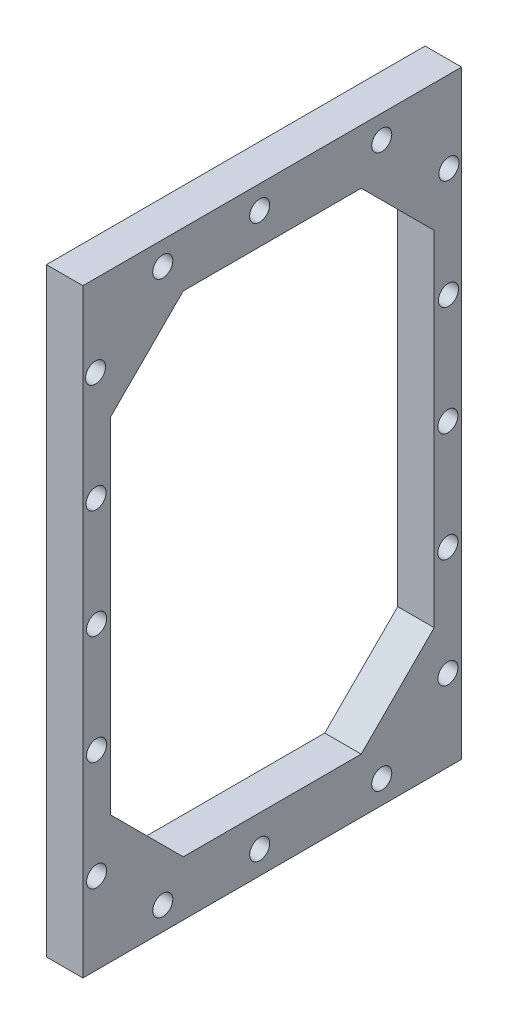
ISO-10303-21;
HEADER;
FILE_DESCRIPTION(('STEP AP214'),'2;1');
FILE_NAME('part.step','',(''),(''),'','','');
FILE_SCHEMA(('AUTOMOTIVE_DESIGN { 1 0 10303 214 1 1 1 1 }'));
ENDSEC;
DATA;
#1=APPLICATION_CONTEXT('core data for automotive mechanical design processes');
#2=APPLICATION_PROTOCOL_DEFINITION('international standard','automotive_design',2000,#1);
#3=PRODUCT_CONTEXT('',#1,'mechanical');
#4=PRODUCT('Part','Part','',(#3));
#5=PRODUCT_RELATED_PRODUCT_CATEGORY('part','',(#4));
#6=PRODUCT_DEFINITION_FORMATION('','',#4);
#7=PRODUCT_DEFINITION_CONTEXT('part definition',#1,'design');
#8=PRODUCT_DEFINITION('design','',#6,#7);
#9=PRODUCT_DEFINITION_SHAPE('','',#8);
#10=(LENGTH_UNIT() NAMED_UNIT(*) SI_UNIT(.MILLI.,.METRE.));
#11=(NAMED_UNIT(*) PLANE_ANGLE_UNIT() SI_UNIT($,.RADIAN.));
#12=(NAMED_UNIT(*) SI_UNIT($,.STERADIAN.) SOLID_ANGLE_UNIT());
#13=UNCERTAINTY_MEASURE_WITH_UNIT(LENGTH_MEASURE(1.E-05),#10,'distance_accuracy_value','');
#14=(GEOMETRIC_REPRESENTATION_CONTEXT(3) GLOBAL_UNCERTAINTY_ASSIGNED_CONTEXT((#13)) GLOBAL_UNIT_ASSIGNED_CONTEXT((#10,
#11,#12)) REPRESENTATION_CONTEXT('',''));
#15=CARTESIAN_POINT('',(0.,0.,0.));
#16=DIRECTION('',(0.,0.,1.));
#17=DIRECTION('',(1.,0.,0.));
#18=AXIS2_PLACEMENT_3D('',#15,#16,#17);
#19=CARTESIAN_POINT('',(-111.248018394775,-161.29907216884,-866.48616104126));
#20=DIRECTION('',(1.,0.,0.));
#21=DIRECTION('',(0.,1.,0.));
#22=AXIS2_PLACEMENT_3D('',#19,#20,#21);
#23=PLANE('',#22);
#24=DIRECTION('',(0.,-0.707106781186548,-0.707106781186548));
#25=VECTOR('',#24,1.);
#26=CARTESIAN_POINT('',(-111.248018394775,-104.161240707768,-900.864127179913));
#27=LINE('',#26,#25);
#28=CARTESIAN_POINT('',(-111.248018394775,-94.1612407077681,-890.864127179913));
#29=VERTEX_POINT('',#28);
#30=CARTESIAN_POINT('',(-111.248018394775,-114.161240707769,-910.864127179913));
#31=VERTEX_POINT('',#30);
#32=EDGE_CURVE('E262',#29,#31,#27,.T.);
#33=ORIENTED_EDGE('',*,*,#32,.F.);
#34=DIRECTION('',(0.,0.,1.));
#35=VECTOR('',#34,1.);
#36=CARTESIAN_POINT('',(-111.248018394775,-94.161240707768,-866.48616104126));
#37=LINE('',#36,#35);
#38=CARTESIAN_POINT('',(-111.248018394775,-94.1612407077679,-842.108168792725));
#39=VERTEX_POINT('',#38);
#40=EDGE_CURVE('E266',#29,#39,#37,.T.);
#41=ORIENTED_EDGE('',*,*,#40,.T.);
#42=DIRECTION('',(0.,0.707106781186544,-0.707106781186551));
#43=VECTOR('',#42,1.);
#44=CARTESIAN_POINT('',(-111.248018394775,-104.161240707768,-832.108168792724));
#45=LINE('',#44,#43);
#46=CARTESIAN_POINT('',(-111.248018394775,-114.161240707769,-822.108168792723));
#47=VERTEX_POINT('',#46);
#48=EDGE_CURVE('E271',#47,#39,#45,.T.);
#49=ORIENTED_EDGE('',*,*,#48,.F.);
#50=DIRECTION('',(0.,1.,0.));
#51=VECTOR('',#50,1.);
#52=CARTESIAN_POINT('',(-111.248018394775,-161.299075828923,-822.108168792723));
#53=LINE('',#52,#51);
#54=CARTESIAN_POINT('',(-111.248018394775,-208.436910950077,-822.108168792723));
#55=VERTEX_POINT('',#54);
#56=EDGE_CURVE('E276',#47,#55,#53,.F.);
#57=ORIENTED_EDGE('',*,*,#56,.T.);
#58=DIRECTION('',(0.,0.707106781186548,0.707106781186548));
#59=VECTOR('',#58,1.);
#60=CARTESIAN_POINT('',(-111.248018394775,-218.436910950078,-832.108168792724));
#61=LINE('',#60,#59);
#62=CARTESIAN_POINT('',(-111.248018394775,-228.436910950078,-842.108168792724));
#63=VERTEX_POINT('',#62);
#64=EDGE_CURVE('E281',#63,#55,#61,.T.);
#65=ORIENTED_EDGE('',*,*,#64,.F.);
#66=DIRECTION('',(0.,0.,1.));
#67=VECTOR('',#66,1.);
#68=CARTESIAN_POINT('',(-111.248018394775,-228.436910950078,-866.48616104126));
#69=LINE('',#68,#67);
#70=CARTESIAN_POINT('',(-111.248018394775,-228.436910950078,-890.864127179914));
#71=VERTEX_POINT('',#70);
#72=EDGE_CURVE('E285',#63,#71,#69,.F.);
#73=ORIENTED_EDGE('',*,*,#72,.T.);
#74=DIRECTION('',(0.,-0.707106781186551,0.707106781186544));
#75=VECTOR('',#74,1.);
#76=CARTESIAN_POINT('',(-111.248018394775,-218.436910950078,-900.864127179913));
#77=LINE('',#76,#75);
#78=CARTESIAN_POINT('',(-111.248018394775,-208.436910950078,-910.864127179913));
#79=VERTEX_POINT('',#78);
#80=EDGE_CURVE('E184',#79,#71,#77,.T.);
#81=ORIENTED_EDGE('',*,*,#80,.F.);
#82=DIRECTION('',(0.,1.,0.));
#83=VECTOR('',#82,1.);
#84=CARTESIAN_POINT('',(-111.248018394775,-161.299075828923,-910.864127179913));
#85=LINE('',#84,#83);
#86=EDGE_CURVE('E254',#79,#31,#85,.T.);
#87=ORIENTED_EDGE('',*,*,#86,.T.);
#88=EDGE_LOOP('',(#33,#41,#49,#57,#65,#73,#81,#87));
#89=FACE_BOUND('',#88,.T.);
#90=CARTESIAN_POINT('',(-111.248018394775,-237.058085341126,-836.486151123046));
#91=DIRECTION('',(1.,0.,0.));
#92=DIRECTION('',(0.,1.,0.));
#93=AXIS2_PLACEMENT_3D('',#90,#91,#92);
#94=CIRCLE('',#93,2.75);
#95=CARTESIAN_POINT('',(-111.248018394775,-234.308085341126,-836.486151123046));
#96=VERTEX_POINT('',#95);
#97=EDGE_CURVE('E181',#96,#96,#94,.T.);
#98=ORIENTED_EDGE('',*,*,#97,.T.);
#99=EDGE_LOOP('',(#98));
#100=FACE_BOUND('',#99,.T.);
#101=CARTESIAN_POINT('',(-111.248018394775,-237.058085341126,-863.047147986318));
#102=DIRECTION('',(1.,0.,0.));
#103=DIRECTION('',(0.,1.,0.));
#104=AXIS2_PLACEMENT_3D('',#101,#102,#103);
#105=CIRCLE('',#104,2.75);
#106=CARTESIAN_POINT('',(-111.248018394775,-234.308085341126,-863.047147986318));
#107=VERTEX_POINT('',#106);
#108=EDGE_CURVE('E185',#107,#107,#105,.T.);
#109=ORIENTED_EDGE('',*,*,#108,.T.);
#110=EDGE_LOOP('',(#109));
#111=FACE_BOUND('',#110,.T.);
#112=CARTESIAN_POINT('',(-111.248018394775,-237.058085341126,-896.486170959472));
#113=DIRECTION('',(1.,0.,0.));
#114=DIRECTION('',(0.,1.,0.));
#115=AXIS2_PLACEMENT_3D('',#112,#113,#114);
#116=CIRCLE('',#115,2.75);
#117=CARTESIAN_POINT('',(-111.248018394775,-234.308085341126,-896.486170959472));
#118=VERTEX_POINT('',#117);
#119=EDGE_CURVE('E188',#118,#118,#116,.T.);
#120=ORIENTED_EDGE('',*,*,#119,.T.);
#121=EDGE_LOOP('',(#120));
#122=FACE_BOUND('',#121,.T.);
#123=CARTESIAN_POINT('',(-111.248018394775,-221.118004896215,-914.614137583116));
#124=DIRECTION('',(1.,0.,0.));
#125=DIRECTION('',(0.,1.,0.));
#126=AXIS2_PLACEMENT_3D('',#123,#124,#125);
#127=CIRCLE('',#126,2.75);
#128=CARTESIAN_POINT('',(-111.248018394775,-218.368004896215,-914.614137583116));
#129=VERTEX_POINT('',#128);
#130=EDGE_CURVE('E191',#129,#129,#127,.T.);
#131=ORIENTED_EDGE('',*,*,#130,.T.);
#132=EDGE_LOOP('',(#131));
#133=FACE_BOUND('',#132,.T.);
#134=CARTESIAN_POINT('',(-111.248018394775,-191.208539447548,-914.614137583116));
#135=DIRECTION('',(1.,0.,0.));
#136=DIRECTION('',(0.,1.,0.));
#137=AXIS2_PLACEMENT_3D('',#134,#135,#136);
#138=CIRCLE('',#137,2.75);
#139=CARTESIAN_POINT('',(-111.248018394775,-188.458539447548,-914.614137583116));
#140=VERTEX_POINT('',#139);
#141=EDGE_CURVE('E194',#140,#140,#138,.T.);
#142=ORIENTED_EDGE('',*,*,#141,.T.);
#143=EDGE_LOOP('',(#142));
#144=FACE_BOUND('',#143,.T.);
#145=CARTESIAN_POINT('',(-111.248018394775,-161.299073998882,-914.614137583116));
#146=DIRECTION('',(1.,0.,0.));
#147=DIRECTION('',(0.,1.,0.));
#148=AXIS2_PLACEMENT_3D('',#145,#146,#147);
#149=CIRCLE('',#148,2.75);
#150=CARTESIAN_POINT('',(-111.248018394775,-158.549073998882,-914.614137583116));
#151=VERTEX_POINT('',#150);
#152=EDGE_CURVE('E197',#151,#151,#149,.T.);
#153=ORIENTED_EDGE('',*,*,#152,.T.);
#154=EDGE_LOOP('',(#153));
#155=FACE_BOUND('',#154,.T.);
#156=CARTESIAN_POINT('',(-111.248018394775,-131.389608550215,-914.760129651494));
#157=DIRECTION('',(1.,0.,0.));
#158=DIRECTION('',(0.,1.,0.));
#159=AXIS2_PLACEMENT_3D('',#156,#157,#158);
#160=CIRCLE('',#159,2.75);
#161=CARTESIAN_POINT('',(-111.248018394775,-128.639608550215,-914.760129651494));
#162=VERTEX_POINT('',#161);
#163=EDGE_CURVE('E200',#162,#162,#160,.T.);
#164=ORIENTED_EDGE('',*,*,#163,.T.);
#165=EDGE_LOOP('',(#164));
#166=FACE_BOUND('',#165,.T.);
#167=CARTESIAN_POINT('',(-111.248018394775,-101.480143101548,-914.906121719873));
#168=DIRECTION('',(1.,0.,0.));
#169=DIRECTION('',(0.,1.,0.));
#170=AXIS2_PLACEMENT_3D('',#167,#168,#169);
#171=CIRCLE('',#170,2.75);
#172=CARTESIAN_POINT('',(-111.248018394775,-98.730143101548,-914.906121719873));
#173=VERTEX_POINT('',#172);
#174=EDGE_CURVE('E203',#173,#173,#171,.T.);
#175=ORIENTED_EDGE('',*,*,#174,.T.);
#176=EDGE_LOOP('',(#175));
#177=FACE_BOUND('',#176,.T.);
#178=CARTESIAN_POINT('',(-111.248018394775,-85.54006631672,-896.486170959472));
#179=DIRECTION('',(1.,0.,0.));
#180=DIRECTION('',(0.,1.,0.));
#181=AXIS2_PLACEMENT_3D('',#178,#179,#180);
#182=CIRCLE('',#181,2.75);
#183=CARTESIAN_POINT('',(-111.248018394775,-82.79006631672,-896.486170959472));
#184=VERTEX_POINT('',#183);
#185=EDGE_CURVE('E206',#184,#184,#182,.T.);
#186=ORIENTED_EDGE('',*,*,#185,.T.);
#187=EDGE_LOOP('',(#186));
#188=FACE_BOUND('',#187,.T.);
#189=CARTESIAN_POINT('',(-111.248018394775,-85.54006631672,-863.047147986318));
#190=DIRECTION('',(1.,0.,0.));
#191=DIRECTION('',(0.,1.,0.));
#192=AXIS2_PLACEMENT_3D('',#189,#190,#191);
#193=CIRCLE('',#192,2.75);
#194=CARTESIAN_POINT('',(-111.248018394775,-82.79006631672,-863.047147986318));
#195=VERTEX_POINT('',#194);
#196=EDGE_CURVE('E209',#195,#195,#193,.T.);
#197=ORIENTED_EDGE('',*,*,#196,.T.);
#198=EDGE_LOOP('',(#197));
#199=FACE_BOUND('',#198,.T.);
#200=CARTESIAN_POINT('',(-111.248018394775,-85.54006631672,-836.486151123046));
#201=DIRECTION('',(1.,0.,0.));
#202=DIRECTION('',(0.,1.,0.));
#203=AXIS2_PLACEMENT_3D('',#200,#201,#202);
#204=CIRCLE('',#203,2.75);
#205=CARTESIAN_POINT('',(-111.248018394775,-82.79006631672,-836.486151123046));
#206=VERTEX_POINT('',#205);
#207=EDGE_CURVE('E212',#206,#206,#204,.T.);
#208=ORIENTED_EDGE('',*,*,#207,.T.);
#209=EDGE_LOOP('',(#208));
#210=FACE_BOUND('',#209,.T.);
#211=CARTESIAN_POINT('',(-111.248018394775,-101.480143101548,-818.066174252764));
#212=DIRECTION('',(1.,0.,0.));
#213=DIRECTION('',(0.,1.,0.));
#214=AXIS2_PLACEMENT_3D('',#211,#212,#213);
#215=CIRCLE('',#214,2.75);
#216=CARTESIAN_POINT('',(-111.248018394775,-98.730143101548,-818.066174252764));
#217=VERTEX_POINT('',#216);
#218=EDGE_CURVE('E215',#217,#217,#215,.T.);
#219=ORIENTED_EDGE('',*,*,#218,.T.);
#220=EDGE_LOOP('',(#219));
#221=FACE_BOUND('',#220,.T.);
#222=CARTESIAN_POINT('',(-111.248018394775,-131.389608550215,-818.212166321142));
#223=DIRECTION('',(1.,0.,0.));
#224=DIRECTION('',(0.,1.,0.));
#225=AXIS2_PLACEMENT_3D('',#222,#223,#224);
#226=CIRCLE('',#225,2.75);
#227=CARTESIAN_POINT('',(-111.248018394775,-128.639608550215,-818.212166321142));
#228=VERTEX_POINT('',#227);
#229=EDGE_CURVE('E218',#228,#228,#226,.T.);
#230=ORIENTED_EDGE('',*,*,#229,.T.);
#231=EDGE_LOOP('',(#230));
#232=FACE_BOUND('',#231,.T.);
#233=CARTESIAN_POINT('',(-111.248018394775,-161.299073998882,-818.358158389521));
#234=DIRECTION('',(1.,0.,0.));
#235=DIRECTION('',(0.,1.,0.));
#236=AXIS2_PLACEMENT_3D('',#233,#234,#235);
#237=CIRCLE('',#236,2.75);
#238=CARTESIAN_POINT('',(-111.248018394775,-158.549073998882,-818.358158389521));
#239=VERTEX_POINT('',#238);
#240=EDGE_CURVE('E221',#239,#239,#237,.T.);
#241=ORIENTED_EDGE('',*,*,#240,.T.);
#242=EDGE_LOOP('',(#241));
#243=FACE_BOUND('',#242,.T.);
#244=CARTESIAN_POINT('',(-111.248018394775,-191.208539447548,-818.358158389521));
#245=DIRECTION('',(1.,0.,0.));
#246=DIRECTION('',(0.,1.,0.));
#247=AXIS2_PLACEMENT_3D('',#244,#245,#246);
#248=CIRCLE('',#247,2.75);
#249=CARTESIAN_POINT('',(-111.248018394775,-188.458539447548,-818.358158389521));
#250=VERTEX_POINT('',#249);
#251=EDGE_CURVE('E223',#250,#250,#248,.T.);
#252=ORIENTED_EDGE('',*,*,#251,.T.);
#253=EDGE_LOOP('',(#252));
#254=FACE_BOUND('',#253,.T.);
#255=CARTESIAN_POINT('',(-111.248018394775,-221.118004896215,-818.358158389521));
#256=DIRECTION('',(1.,0.,0.));
#257=DIRECTION('',(0.,1.,0.));
#258=AXIS2_PLACEMENT_3D('',#255,#256,#257);
#259=CIRCLE('',#258,2.75);
#260=CARTESIAN_POINT('',(-111.248018394775,-218.368004896215,-818.358158389521));
#261=VERTEX_POINT('',#260);
#262=EDGE_CURVE('E20',#261,#261,#259,.T.);
#263=ORIENTED_EDGE('',*,*,#262,.T.);
#264=EDGE_LOOP('',(#263));
#265=FACE_BOUND('',#264,.T.);
#266=DIRECTION('',(0.,1.,0.));
#267=VECTOR('',#266,1.);
#268=CARTESIAN_POINT('',(-111.248018394775,-161.29907216884,-918.3641740962));
#269=LINE('',#268,#267);
#270=CARTESIAN_POINT('',(-111.248018394775,-79.1612001802771,-918.3641740962));
#271=VERTEX_POINT('',#270);
#272=CARTESIAN_POINT('',(-111.248018394775,-243.436944157404,-918.3641740962));
#273=VERTEX_POINT('',#272);
#274=EDGE_CURVE('E231',#271,#273,#269,.F.);
#275=ORIENTED_EDGE('',*,*,#274,.T.);
#276=DIRECTION('',(0.,0.,1.));
#277=VECTOR('',#276,1.);
#278=CARTESIAN_POINT('',(-111.248018394775,-243.436944157404,-866.48616104126));
#279=LINE('',#278,#277);
#280=CARTESIAN_POINT('',(-111.248018394775,-243.436944157404,-814.608147986318));
#281=VERTEX_POINT('',#280);
#282=EDGE_CURVE('E104',#273,#281,#279,.T.);
#283=ORIENTED_EDGE('',*,*,#282,.T.);
#284=DIRECTION('',(0.,1.,0.));
#285=VECTOR('',#284,1.);
#286=CARTESIAN_POINT('',(-111.248018394775,-161.29907216884,-814.608147986318));
#287=LINE('',#286,#285);
#288=CARTESIAN_POINT('',(-111.248018394775,-79.1612001802771,-814.608147986318));
#289=VERTEX_POINT('',#288);
#290=EDGE_CURVE('E106',#281,#289,#287,.T.);
#291=ORIENTED_EDGE('',*,*,#290,.T.);
#292=DIRECTION('',(0.,0.,1.));
#293=VECTOR('',#292,1.);
#294=CARTESIAN_POINT('',(-111.248018394775,-79.1612001802771,-866.48616104126));
#295=LINE('',#294,#293);
#296=EDGE_CURVE('E108',#289,#271,#295,.F.);
#297=ORIENTED_EDGE('',*,*,#296,.T.);
#298=EDGE_LOOP('',(#275,#283,#291,#297));
#299=FACE_BOUND('',#298,.T.);
#300=ADVANCED_FACE('F17',(#89,#100,#111,#122,#133,#144,#155,#166,#177,#188,#199,#210,#221,#232,
#243,#254,#265,#299),#23,.F.);
#301=CARTESIAN_POINT('',(-106.248018394775,-79.1612001802771,-866.48616104126));
#302=DIRECTION('',(0.,-1.,0.));
#303=DIRECTION('',(1.,0.,0.));
#304=AXIS2_PLACEMENT_3D('',#301,#302,#303);
#305=PLANE('',#304);
#306=ORIENTED_EDGE('',*,*,#296,.F.);
#307=DIRECTION('',(-1.,0.,0.));
#308=VECTOR('',#307,1.);
#309=CARTESIAN_POINT('',(-106.248018394775,-79.1612001802771,-814.608147986318));
#310=LINE('',#309,#308);
#311=CARTESIAN_POINT('',(-101.248018394775,-79.1612001802771,-814.608147986318));
#312=VERTEX_POINT('',#311);
#313=EDGE_CURVE('E113',#289,#312,#310,.F.);
#314=ORIENTED_EDGE('',*,*,#313,.T.);
#315=DIRECTION('',(0.,0.,1.));
#316=VECTOR('',#315,1.);
#317=CARTESIAN_POINT('',(-101.248018394775,-79.1612001802771,-866.48616104126));
#318=LINE('',#317,#316);
#319=CARTESIAN_POINT('',(-101.248018394775,-79.1612001802771,-918.3641740962));
#320=VERTEX_POINT('',#319);
#321=EDGE_CURVE('E248',#320,#312,#318,.T.);
#322=ORIENTED_EDGE('',*,*,#321,.F.);
#323=DIRECTION('',(1.,0.,0.));
#324=VECTOR('',#323,1.);
#325=CARTESIAN_POINT('',(-106.248018394775,-79.1612001802771,-918.3641740962));
#326=LINE('',#325,#324);
#327=EDGE_CURVE('E119',#320,#271,#326,.F.);
#328=ORIENTED_EDGE('',*,*,#327,.T.);
#329=EDGE_LOOP('',(#306,#314,#322,#328));
#330=FACE_BOUND('',#329,.T.);
#331=ADVANCED_FACE('F116',(#330),#305,.F.);
#332=CARTESIAN_POINT('',(-106.248018394775,-161.29907216884,-814.608147986318));
#333=DIRECTION('',(0.,0.,-1.));
#334=DIRECTION('',(-1.,0.,0.));
#335=AXIS2_PLACEMENT_3D('',#332,#333,#334);
#336=PLANE('',#335);
#337=ORIENTED_EDGE('',*,*,#290,.F.);
#338=DIRECTION('',(-1.,0.,0.));
#339=VECTOR('',#338,1.);
#340=CARTESIAN_POINT('',(-106.248018394775,-243.436944157404,-814.608147986318));
#341=LINE('',#340,#339);
#342=CARTESIAN_POINT('',(-101.248018394775,-243.436944157404,-814.608147986318));
#343=VERTEX_POINT('',#342);
#344=EDGE_CURVE('E127',#281,#343,#341,.F.);
#345=ORIENTED_EDGE('',*,*,#344,.T.);
#346=DIRECTION('',(0.,1.,0.));
#347=VECTOR('',#346,1.);
#348=CARTESIAN_POINT('',(-101.248018394775,-161.29907216884,-814.608147986318));
#349=LINE('',#348,#347);
#350=EDGE_CURVE('E124',#312,#343,#349,.F.);
#351=ORIENTED_EDGE('',*,*,#350,.F.);
#352=ORIENTED_EDGE('',*,*,#313,.F.);
#353=EDGE_LOOP('',(#337,#345,#351,#352));
#354=FACE_BOUND('',#353,.T.);
#355=ADVANCED_FACE('F122',(#354),#336,.F.);
#356=CARTESIAN_POINT('',(-106.248018394775,-243.436944157404,-866.48616104126));
#357=DIRECTION('',(0.,1.,0.));
#358=DIRECTION('',(-1.,0.,0.));
#359=AXIS2_PLACEMENT_3D('',#356,#357,#358);
#360=PLANE('',#359);
#361=ORIENTED_EDGE('',*,*,#282,.F.);
#362=DIRECTION('',(1.,0.,0.));
#363=VECTOR('',#362,1.);
#364=CARTESIAN_POINT('',(-106.248018394775,-243.436944157404,-918.3641740962));
#365=LINE('',#364,#363);
#366=CARTESIAN_POINT('',(-101.248018394775,-243.436944157404,-918.3641740962));
#367=VERTEX_POINT('',#366);
#368=EDGE_CURVE('E228',#273,#367,#365,.T.);
#369=ORIENTED_EDGE('',*,*,#368,.T.);
#370=DIRECTION('',(0.,0.,1.));
#371=VECTOR('',#370,1.);
#372=CARTESIAN_POINT('',(-101.248018394775,-243.436944157404,-866.48616104126));
#373=LINE('',#372,#371);
#374=EDGE_CURVE('E242',#343,#367,#373,.F.);
#375=ORIENTED_EDGE('',*,*,#374,.F.);
#376=ORIENTED_EDGE('',*,*,#344,.F.);
#377=EDGE_LOOP('',(#361,#369,#375,#376));
#378=FACE_BOUND('',#377,.T.);
#379=ADVANCED_FACE('F243',(#378),#360,.F.);
#380=CARTESIAN_POINT('',(-106.248018394775,-161.29907216884,-918.3641740962));
#381=DIRECTION('',(0.,0.,1.));
#382=DIRECTION('',(1.,0.,0.));
#383=AXIS2_PLACEMENT_3D('',#380,#381,#382);
#384=PLANE('',#383);
#385=ORIENTED_EDGE('',*,*,#274,.F.);
#386=ORIENTED_EDGE('',*,*,#327,.F.);
#387=DIRECTION('',(0.,1.,0.));
#388=VECTOR('',#387,1.);
#389=CARTESIAN_POINT('',(-101.248018394775,-161.29907216884,-918.3641740962));
#390=LINE('',#389,#388);
#391=EDGE_CURVE('E180',#367,#320,#390,.T.);
#392=ORIENTED_EDGE('',*,*,#391,.F.);
#393=ORIENTED_EDGE('',*,*,#368,.F.);
#394=EDGE_LOOP('',(#385,#386,#392,#393));
#395=FACE_BOUND('',#394,.T.);
#396=ADVANCED_FACE('F310',(#395),#384,.F.);
#397=CARTESIAN_POINT('',(-111.248018394775,-221.118004896215,-818.358158389521));
#398=DIRECTION('',(1.,0.,0.));
#399=DIRECTION('',(0.,1.,0.));
#400=AXIS2_PLACEMENT_3D('',#397,#398,#399);
#401=CYLINDRICAL_SURFACE('',#400,2.75);
#402=CARTESIAN_POINT('',(-101.248018394775,-221.118004896215,-818.358158389521));
#403=DIRECTION('',(1.,0.,0.));
#404=DIRECTION('',(0.,1.,0.));
#405=AXIS2_PLACEMENT_3D('',#402,#403,#404);
#406=CIRCLE('',#405,2.75);
#407=CARTESIAN_POINT('',(-101.248018394775,-218.368004896215,-818.358158389521));
#408=VERTEX_POINT('',#407);
#409=EDGE_CURVE('E177',#408,#408,#406,.F.);
#410=ORIENTED_EDGE('',*,*,#409,.F.);
#411=EDGE_LOOP('',(#410));
#412=FACE_BOUND('',#411,.T.);
#413=ORIENTED_EDGE('',*,*,#262,.F.);
#414=EDGE_LOOP('',(#413));
#415=FACE_BOUND('',#414,.T.);
#416=ADVANCED_FACE('F312',(#412,#415),#401,.F.);
#417=CARTESIAN_POINT('',(-111.248018394775,-191.208539447548,-818.358158389521));
#418=DIRECTION('',(1.,0.,0.));
#419=DIRECTION('',(0.,1.,0.));
#420=AXIS2_PLACEMENT_3D('',#417,#418,#419);
#421=CYLINDRICAL_SURFACE('',#420,2.75);
#422=CARTESIAN_POINT('',(-101.248018394775,-191.208539447548,-818.358158389521));
#423=DIRECTION('',(1.,0.,0.));
#424=DIRECTION('',(0.,1.,0.));
#425=AXIS2_PLACEMENT_3D('',#422,#423,#424);
#426=CIRCLE('',#425,2.75);
#427=CARTESIAN_POINT('',(-101.248018394775,-188.458539447548,-818.358158389521));
#428=VERTEX_POINT('',#427);
#429=EDGE_CURVE('E174',#428,#428,#426,.F.);
#430=ORIENTED_EDGE('',*,*,#429,.F.);
#431=EDGE_LOOP('',(#430));
#432=FACE_BOUND('',#431,.T.);
#433=ORIENTED_EDGE('',*,*,#251,.F.);
#434=EDGE_LOOP('',(#433));
#435=FACE_BOUND('',#434,.T.);
#436=ADVANCED_FACE('F319',(#432,#435),#421,.F.);
#437=CARTESIAN_POINT('',(-111.248018394775,-161.299073998882,-818.358158389521));
#438=DIRECTION('',(1.,0.,0.));
#439=DIRECTION('',(0.,1.,0.));
#440=AXIS2_PLACEMENT_3D('',#437,#438,#439);
#441=CYLINDRICAL_SURFACE('',#440,2.75);
#442=CARTESIAN_POINT('',(-101.248018394775,-161.299073998882,-818.358158389521));
#443=DIRECTION('',(1.,0.,0.));
#444=DIRECTION('',(0.,1.,0.));
#445=AXIS2_PLACEMENT_3D('',#442,#443,#444);
#446=CIRCLE('',#445,2.75);
#447=CARTESIAN_POINT('',(-101.248018394775,-158.549073998882,-818.358158389521));
#448=VERTEX_POINT('',#447);
#449=EDGE_CURVE('E171',#448,#448,#446,.F.);
#450=ORIENTED_EDGE('',*,*,#449,.F.);
#451=EDGE_LOOP('',(#450));
#452=FACE_BOUND('',#451,.T.);
#453=ORIENTED_EDGE('',*,*,#240,.F.);
#454=EDGE_LOOP('',(#453));
#455=FACE_BOUND('',#454,.T.);
#456=ADVANCED_FACE('F406',(#452,#455),#441,.F.);
#457=CARTESIAN_POINT('',(-111.248018394775,-131.389608550215,-818.212166321142));
#458=DIRECTION('',(1.,0.,0.));
#459=DIRECTION('',(0.,1.,0.));
#460=AXIS2_PLACEMENT_3D('',#457,#458,#459);
#461=CYLINDRICAL_SURFACE('',#460,2.75);
#462=CARTESIAN_POINT('',(-101.248018394775,-131.389608550215,-818.212166321142));
#463=DIRECTION('',(1.,0.,0.));
#464=DIRECTION('',(0.,1.,0.));
#465=AXIS2_PLACEMENT_3D('',#462,#463,#464);
#466=CIRCLE('',#465,2.75);
#467=CARTESIAN_POINT('',(-101.248018394775,-128.639608550215,-818.212166321142));
#468=VERTEX_POINT('',#467);
#469=EDGE_CURVE('E168',#468,#468,#466,.F.);
#470=ORIENTED_EDGE('',*,*,#469,.F.);
#471=EDGE_LOOP('',(#470));
#472=FACE_BOUND('',#471,.T.);
#473=ORIENTED_EDGE('',*,*,#229,.F.);
#474=EDGE_LOOP('',(#473));
#475=FACE_BOUND('',#474,.T.);
#476=ADVANCED_FACE('F402',(#472,#475),#461,.F.);
#477=CARTESIAN_POINT('',(-111.248018394775,-101.480143101548,-818.066174252764));
#478=DIRECTION('',(1.,0.,0.));
#479=DIRECTION('',(0.,1.,0.));
#480=AXIS2_PLACEMENT_3D('',#477,#478,#479);
#481=CYLINDRICAL_SURFACE('',#480,2.75);
#482=CARTESIAN_POINT('',(-101.248018394775,-101.480143101548,-818.066174252764));
#483=DIRECTION('',(1.,0.,0.));
#484=DIRECTION('',(0.,1.,0.));
#485=AXIS2_PLACEMENT_3D('',#482,#483,#484);
#486=CIRCLE('',#485,2.75);
#487=CARTESIAN_POINT('',(-101.248018394775,-98.730143101548,-818.066174252764));
#488=VERTEX_POINT('',#487);
#489=EDGE_CURVE('E165',#488,#488,#486,.F.);
#490=ORIENTED_EDGE('',*,*,#489,.F.);
#491=EDGE_LOOP('',(#490));
#492=FACE_BOUND('',#491,.T.);
#493=ORIENTED_EDGE('',*,*,#218,.F.);
#494=EDGE_LOOP('',(#493));
#495=FACE_BOUND('',#494,.T.);
#496=ADVANCED_FACE('F398',(#492,#495),#481,.F.);
#497=CARTESIAN_POINT('',(-111.248018394775,-85.54006631672,-836.486151123046));
#498=DIRECTION('',(1.,0.,0.));
#499=DIRECTION('',(0.,1.,0.));
#500=AXIS2_PLACEMENT_3D('',#497,#498,#499);
#501=CYLINDRICAL_SURFACE('',#500,2.75);
#502=CARTESIAN_POINT('',(-101.248018394775,-85.54006631672,-836.486151123046));
#503=DIRECTION('',(1.,0.,0.));
#504=DIRECTION('',(0.,1.,0.));
#505=AXIS2_PLACEMENT_3D('',#502,#503,#504);
#506=CIRCLE('',#505,2.75);
#507=CARTESIAN_POINT('',(-101.248018394775,-82.79006631672,-836.486151123046));
#508=VERTEX_POINT('',#507);
#509=EDGE_CURVE('E162',#508,#508,#506,.F.);
#510=ORIENTED_EDGE('',*,*,#509,.F.);
#511=EDGE_LOOP('',(#510));
#512=FACE_BOUND('',#511,.T.);
#513=ORIENTED_EDGE('',*,*,#207,.F.);
#514=EDGE_LOOP('',(#513));
#515=FACE_BOUND('',#514,.T.);
#516=ADVANCED_FACE('F394',(#512,#515),#501,.F.);
#517=CARTESIAN_POINT('',(-111.248018394775,-85.54006631672,-863.047147986318));
#518=DIRECTION('',(1.,0.,0.));
#519=DIRECTION('',(0.,1.,0.));
#520=AXIS2_PLACEMENT_3D('',#517,#518,#519);
#521=CYLINDRICAL_SURFACE('',#520,2.75);
#522=CARTESIAN_POINT('',(-101.248018394775,-85.54006631672,-863.047147986318));
#523=DIRECTION('',(1.,0.,0.));
#524=DIRECTION('',(0.,1.,0.));
#525=AXIS2_PLACEMENT_3D('',#522,#523,#524);
#526=CIRCLE('',#525,2.75);
#527=CARTESIAN_POINT('',(-101.248018394775,-82.79006631672,-863.047147986318));
#528=VERTEX_POINT('',#527);
#529=EDGE_CURVE('E159',#528,#528,#526,.F.);
#530=ORIENTED_EDGE('',*,*,#529,.F.);
#531=EDGE_LOOP('',(#530));
#532=FACE_BOUND('',#531,.T.);
#533=ORIENTED_EDGE('',*,*,#196,.F.);
#534=EDGE_LOOP('',(#533));
#535=FACE_BOUND('',#534,.T.);
#536=ADVANCED_FACE('F390',(#532,#535),#521,.F.);
#537=CARTESIAN_POINT('',(-111.248018394775,-85.54006631672,-896.486170959472));
#538=DIRECTION('',(1.,0.,0.));
#539=DIRECTION('',(0.,1.,0.));
#540=AXIS2_PLACEMENT_3D('',#537,#538,#539);
#541=CYLINDRICAL_SURFACE('',#540,2.75);
#542=CARTESIAN_POINT('',(-101.248018394775,-85.54006631672,-896.486170959472));
#543=DIRECTION('',(1.,0.,0.));
#544=DIRECTION('',(0.,1.,0.));
#545=AXIS2_PLACEMENT_3D('',#542,#543,#544);
#546=CIRCLE('',#545,2.75);
#547=CARTESIAN_POINT('',(-101.248018394775,-82.79006631672,-896.486170959472));
#548=VERTEX_POINT('',#547);
#549=EDGE_CURVE('E156',#548,#548,#546,.F.);
#550=ORIENTED_EDGE('',*,*,#549,.F.);
#551=EDGE_LOOP('',(#550));
#552=FACE_BOUND('',#551,.T.);
#553=ORIENTED_EDGE('',*,*,#185,.F.);
#554=EDGE_LOOP('',(#553));
#555=FACE_BOUND('',#554,.T.);
#556=ADVANCED_FACE('F386',(#552,#555),#541,.F.);
#557=CARTESIAN_POINT('',(-111.248018394775,-101.480143101548,-914.906121719873));
#558=DIRECTION('',(1.,0.,0.));
#559=DIRECTION('',(0.,1.,0.));
#560=AXIS2_PLACEMENT_3D('',#557,#558,#559);
#561=CYLINDRICAL_SURFACE('',#560,2.75);
#562=CARTESIAN_POINT('',(-101.248018394775,-101.480143101548,-914.906121719873));
#563=DIRECTION('',(1.,0.,0.));
#564=DIRECTION('',(0.,1.,0.));
#565=AXIS2_PLACEMENT_3D('',#562,#563,#564);
#566=CIRCLE('',#565,2.75);
#567=CARTESIAN_POINT('',(-101.248018394775,-98.730143101548,-914.906121719873));
#568=VERTEX_POINT('',#567);
#569=EDGE_CURVE('E153',#568,#568,#566,.F.);
#570=ORIENTED_EDGE('',*,*,#569,.F.);
#571=EDGE_LOOP('',(#570));
#572=FACE_BOUND('',#571,.T.);
#573=ORIENTED_EDGE('',*,*,#174,.F.);
#574=EDGE_LOOP('',(#573));
#575=FACE_BOUND('',#574,.T.);
#576=ADVANCED_FACE('F382',(#572,#575),#561,.F.);
#577=CARTESIAN_POINT('',(-111.248018394775,-131.389608550215,-914.760129651494));
#578=DIRECTION('',(1.,0.,0.));
#579=DIRECTION('',(0.,1.,0.));
#580=AXIS2_PLACEMENT_3D('',#577,#578,#579);
#581=CYLINDRICAL_SURFACE('',#580,2.75);
#582=ORIENTED_EDGE('',*,*,#163,.F.);
#583=EDGE_LOOP('',(#582));
#584=FACE_BOUND('',#583,.T.);
#585=CARTESIAN_POINT('',(-101.248018394775,-131.389608550215,-914.760129651494));
#586=DIRECTION('',(1.,0.,0.));
#587=DIRECTION('',(0.,1.,0.));
#588=AXIS2_PLACEMENT_3D('',#585,#586,#587);
#589=CIRCLE('',#588,2.75);
#590=CARTESIAN_POINT('',(-101.248018394775,-128.639608550215,-914.760129651494));
#591=VERTEX_POINT('',#590);
#592=EDGE_CURVE('E150',#591,#591,#589,.F.);
#593=ORIENTED_EDGE('',*,*,#592,.F.);
#594=EDGE_LOOP('',(#593));
#595=FACE_BOUND('',#594,.T.);
#596=ADVANCED_FACE('F378',(#584,#595),#581,.F.);
#597=CARTESIAN_POINT('',(-111.248018394775,-161.299073998882,-914.614137583116));
#598=DIRECTION('',(1.,0.,0.));
#599=DIRECTION('',(0.,1.,0.));
#600=AXIS2_PLACEMENT_3D('',#597,#598,#599);
#601=CYLINDRICAL_SURFACE('',#600,2.75);
#602=CARTESIAN_POINT('',(-101.248018394775,-161.299073998882,-914.614137583116));
#603=DIRECTION('',(1.,0.,0.));
#604=DIRECTION('',(0.,1.,0.));
#605=AXIS2_PLACEMENT_3D('',#602,#603,#604);
#606=CIRCLE('',#605,2.75);
#607=CARTESIAN_POINT('',(-101.248018394775,-158.549073998882,-914.614137583116));
#608=VERTEX_POINT('',#607);
#609=EDGE_CURVE('E147',#608,#608,#606,.F.);
#610=ORIENTED_EDGE('',*,*,#609,.F.);
#611=EDGE_LOOP('',(#610));
#612=FACE_BOUND('',#611,.T.);
#613=ORIENTED_EDGE('',*,*,#152,.F.);
#614=EDGE_LOOP('',(#613));
#615=FACE_BOUND('',#614,.T.);
#616=ADVANCED_FACE('F374',(#612,#615),#601,.F.);
#617=CARTESIAN_POINT('',(-111.248018394775,-191.208539447548,-914.614137583116));
#618=DIRECTION('',(1.,0.,0.));
#619=DIRECTION('',(0.,1.,0.));
#620=AXIS2_PLACEMENT_3D('',#617,#618,#619);
#621=CYLINDRICAL_SURFACE('',#620,2.75);
#622=CARTESIAN_POINT('',(-101.248018394775,-191.208539447548,-914.614137583116));
#623=DIRECTION('',(1.,0.,0.));
#624=DIRECTION('',(0.,1.,0.));
#625=AXIS2_PLACEMENT_3D('',#622,#623,#624);
#626=CIRCLE('',#625,2.75);
#627=CARTESIAN_POINT('',(-101.248018394775,-188.458539447548,-914.614137583116));
#628=VERTEX_POINT('',#627);
#629=EDGE_CURVE('E144',#628,#628,#626,.F.);
#630=ORIENTED_EDGE('',*,*,#629,.F.);
#631=EDGE_LOOP('',(#630));
#632=FACE_BOUND('',#631,.T.);
#633=ORIENTED_EDGE('',*,*,#141,.F.);
#634=EDGE_LOOP('',(#633));
#635=FACE_BOUND('',#634,.T.);
#636=ADVANCED_FACE('F370',(#632,#635),#621,.F.);
#637=CARTESIAN_POINT('',(-111.248018394775,-221.118004896215,-914.614137583116));
#638=DIRECTION('',(1.,0.,0.));
#639=DIRECTION('',(0.,1.,0.));
#640=AXIS2_PLACEMENT_3D('',#637,#638,#639);
#641=CYLINDRICAL_SURFACE('',#640,2.75);
#642=CARTESIAN_POINT('',(-101.248018394775,-221.118004896215,-914.614137583116));
#643=DIRECTION('',(1.,0.,0.));
#644=DIRECTION('',(0.,1.,0.));
#645=AXIS2_PLACEMENT_3D('',#642,#643,#644);
#646=CIRCLE('',#645,2.75);
#647=CARTESIAN_POINT('',(-101.248018394775,-218.368004896215,-914.614137583116));
#648=VERTEX_POINT('',#647);
#649=EDGE_CURVE('E141',#648,#648,#646,.F.);
#650=ORIENTED_EDGE('',*,*,#649,.F.);
#651=EDGE_LOOP('',(#650));
#652=FACE_BOUND('',#651,.T.);
#653=ORIENTED_EDGE('',*,*,#130,.F.);
#654=EDGE_LOOP('',(#653));
#655=FACE_BOUND('',#654,.T.);
#656=ADVANCED_FACE('F366',(#652,#655),#641,.F.);
#657=CARTESIAN_POINT('',(-111.248018394775,-237.058085341126,-896.486170959472));
#658=DIRECTION('',(1.,0.,0.));
#659=DIRECTION('',(0.,1.,0.));
#660=AXIS2_PLACEMENT_3D('',#657,#658,#659);
#661=CYLINDRICAL_SURFACE('',#660,2.75);
#662=CARTESIAN_POINT('',(-101.248018394775,-237.058085341126,-896.486170959472));
#663=DIRECTION('',(1.,0.,0.));
#664=DIRECTION('',(0.,1.,0.));
#665=AXIS2_PLACEMENT_3D('',#662,#663,#664);
#666=CIRCLE('',#665,2.75);
#667=CARTESIAN_POINT('',(-101.248018394775,-234.308085341126,-896.486170959472));
#668=VERTEX_POINT('',#667);
#669=EDGE_CURVE('E138',#668,#668,#666,.F.);
#670=ORIENTED_EDGE('',*,*,#669,.F.);
#671=EDGE_LOOP('',(#670));
#672=FACE_BOUND('',#671,.T.);
#673=ORIENTED_EDGE('',*,*,#119,.F.);
#674=EDGE_LOOP('',(#673));
#675=FACE_BOUND('',#674,.T.);
#676=ADVANCED_FACE('F362',(#672,#675),#661,.F.);
#677=CARTESIAN_POINT('',(-111.248018394775,-237.058085341126,-863.047147986318));
#678=DIRECTION('',(1.,0.,0.));
#679=DIRECTION('',(0.,1.,0.));
#680=AXIS2_PLACEMENT_3D('',#677,#678,#679);
#681=CYLINDRICAL_SURFACE('',#680,2.75);
#682=ORIENTED_EDGE('',*,*,#108,.F.);
#683=EDGE_LOOP('',(#682));
#684=FACE_BOUND('',#683,.T.);
#685=CARTESIAN_POINT('',(-101.248018394775,-237.058085341126,-863.047147986318));
#686=DIRECTION('',(1.,0.,0.));
#687=DIRECTION('',(0.,1.,0.));
#688=AXIS2_PLACEMENT_3D('',#685,#686,#687);
#689=CIRCLE('',#688,2.75);
#690=CARTESIAN_POINT('',(-101.248018394775,-234.308085341126,-863.047147986318));
#691=VERTEX_POINT('',#690);
#692=EDGE_CURVE('E135',#691,#691,#689,.F.);
#693=ORIENTED_EDGE('',*,*,#692,.F.);
#694=EDGE_LOOP('',(#693));
#695=FACE_BOUND('',#694,.T.);
#696=ADVANCED_FACE('F358',(#684,#695),#681,.F.);
#697=CARTESIAN_POINT('',(-111.248018394775,-237.058085341126,-836.486151123046));
#698=DIRECTION('',(1.,0.,0.));
#699=DIRECTION('',(0.,1.,0.));
#700=AXIS2_PLACEMENT_3D('',#697,#698,#699);
#701=CYLINDRICAL_SURFACE('',#700,2.75);
#702=ORIENTED_EDGE('',*,*,#97,.F.);
#703=EDGE_LOOP('',(#702));
#704=FACE_BOUND('',#703,.T.);
#705=CARTESIAN_POINT('',(-101.248018394775,-237.058085341126,-836.486151123046));
#706=DIRECTION('',(1.,0.,0.));
#707=DIRECTION('',(0.,1.,0.));
#708=AXIS2_PLACEMENT_3D('',#705,#706,#707);
#709=CIRCLE('',#708,2.75);
#710=CARTESIAN_POINT('',(-101.248018394775,-234.308085341126,-836.486151123046));
#711=VERTEX_POINT('',#710);
#712=EDGE_CURVE('E131',#711,#711,#709,.F.);
#713=ORIENTED_EDGE('',*,*,#712,.F.);
#714=EDGE_LOOP('',(#713));
#715=FACE_BOUND('',#714,.T.);
#716=ADVANCED_FACE('F355',(#704,#715),#701,.F.);
#717=CARTESIAN_POINT('',(-111.248017299334,-218.436910950078,-900.864127179913));
#718=DIRECTION('',(0.,0.707106781186544,0.707106781186551));
#719=DIRECTION('',(0.,-0.707106781186551,0.707106781186544));
#720=AXIS2_PLACEMENT_3D('',#717,#718,#719);
#721=PLANE('',#720);
#722=DIRECTION('',(0.,-0.707106781186547,0.707106781186548));
#723=VECTOR('',#722,1.);
#724=CARTESIAN_POINT('',(-101.248018394775,-208.436910950078,-910.864127179913));
#725=LINE('',#724,#723);
#726=CARTESIAN_POINT('',(-101.248018120915,-208.436910950078,-910.864127179913));
#727=VERTEX_POINT('',#726);
#728=CARTESIAN_POINT('',(-101.248017983985,-228.436910950078,-890.864127179914));
#729=VERTEX_POINT('',#728);
#730=EDGE_CURVE('E134',#727,#729,#725,.T.);
#731=ORIENTED_EDGE('',*,*,#730,.F.);
#732=DIRECTION('',(-1.,0.,0.));
#733=VECTOR('',#732,1.);
#734=CARTESIAN_POINT('',(-111.248017299334,-208.436910950078,-910.864127179913));
#735=LINE('',#734,#733);
#736=EDGE_CURVE('E256',#727,#79,#735,.T.);
#737=ORIENTED_EDGE('',*,*,#736,.T.);
#738=ORIENTED_EDGE('',*,*,#80,.T.);
#739=DIRECTION('',(1.,0.,0.));
#740=VECTOR('',#739,1.);
#741=CARTESIAN_POINT('',(-111.248017299334,-228.436910950078,-890.864127179914));
#742=LINE('',#741,#740);
#743=EDGE_CURVE('E284',#71,#729,#742,.T.);
#744=ORIENTED_EDGE('',*,*,#743,.T.);
#745=EDGE_LOOP('',(#731,#737,#738,#744));
#746=FACE_BOUND('',#745,.T.);
#747=ADVANCED_FACE('F291',(#746),#721,.T.);
#748=CARTESIAN_POINT('',(-111.248017299334,-228.436910950078,-866.48616104126));
#749=DIRECTION('',(0.,-1.,0.));
#750=DIRECTION('',(1.,0.,0.));
#751=AXIS2_PLACEMENT_3D('',#748,#749,#750);
#752=PLANE('',#751);
#753=ORIENTED_EDGE('',*,*,#72,.F.);
#754=DIRECTION('',(1.,0.,0.));
#755=VECTOR('',#754,1.);
#756=CARTESIAN_POINT('',(-111.248017299334,-228.436910950078,-842.108168792724));
#757=LINE('',#756,#755);
#758=CARTESIAN_POINT('',(-101.248018120915,-228.436910950078,-842.108168792724));
#759=VERTEX_POINT('',#758);
#760=EDGE_CURVE('E278',#759,#63,#757,.F.);
#761=ORIENTED_EDGE('',*,*,#760,.F.);
#762=DIRECTION('',(0.,0.,1.));
#763=VECTOR('',#762,1.);
#764=CARTESIAN_POINT('',(-101.248018394775,-228.436910950078,-866.48616104126));
#765=LINE('',#764,#763);
#766=EDGE_CURVE('E298',#729,#759,#765,.T.);
#767=ORIENTED_EDGE('',*,*,#766,.F.);
#768=ORIENTED_EDGE('',*,*,#743,.F.);
#769=EDGE_LOOP('',(#753,#761,#767,#768));
#770=FACE_BOUND('',#769,.T.);
#771=ADVANCED_FACE('F296',(#770),#752,.F.);
#772=CARTESIAN_POINT('',(-111.248017299334,-218.436910950078,-832.108168792724));
#773=DIRECTION('',(0.,0.707106781186548,-0.707106781186548));
#774=DIRECTION('',(0.,0.707106781186548,0.707106781186548));
#775=AXIS2_PLACEMENT_3D('',#772,#773,#774);
#776=PLANE('',#775);
#777=DIRECTION('',(0.,0.707106781186547,0.707106781186548));
#778=VECTOR('',#777,1.);
#779=CARTESIAN_POINT('',(-101.248018394775,-228.436910950078,-842.108168792724));
#780=LINE('',#779,#778);
#781=CARTESIAN_POINT('',(-101.248018394775,-208.436910950077,-822.108168792723));
#782=VERTEX_POINT('',#781);
#783=EDGE_CURVE('E303',#759,#782,#780,.T.);
#784=ORIENTED_EDGE('',*,*,#783,.F.);
#785=ORIENTED_EDGE('',*,*,#760,.T.);
#786=ORIENTED_EDGE('',*,*,#64,.T.);
#787=DIRECTION('',(1.,0.,0.));
#788=VECTOR('',#787,1.);
#789=CARTESIAN_POINT('',(-111.248017299334,-208.436910950077,-822.108168792723));
#790=LINE('',#789,#788);
#791=EDGE_CURVE('E274',#55,#782,#790,.T.);
#792=ORIENTED_EDGE('',*,*,#791,.T.);
#793=EDGE_LOOP('',(#784,#785,#786,#792));
#794=FACE_BOUND('',#793,.T.);
#795=ADVANCED_FACE('F346',(#794),#776,.T.);
#796=CARTESIAN_POINT('',(-111.248017299334,-161.299075828923,-822.108168792723));
#797=DIRECTION('',(0.,0.,1.));
#798=DIRECTION('',(1.,0.,0.));
#799=AXIS2_PLACEMENT_3D('',#796,#797,#798);
#800=PLANE('',#799);
#801=DIRECTION('',(0.,1.,0.));
#802=VECTOR('',#801,1.);
#803=CARTESIAN_POINT('',(-101.248018394775,-161.29907216884,-822.108168792723));
#804=LINE('',#803,#802);
#805=CARTESIAN_POINT('',(-101.248018257845,-114.161240707769,-822.108168792723));
#806=VERTEX_POINT('',#805);
#807=EDGE_CURVE('E686',#782,#806,#804,.T.);
#808=ORIENTED_EDGE('',*,*,#807,.F.);
#809=ORIENTED_EDGE('',*,*,#791,.F.);
#810=ORIENTED_EDGE('',*,*,#56,.F.);
#811=DIRECTION('',(1.,0.,0.));
#812=VECTOR('',#811,1.);
#813=CARTESIAN_POINT('',(-111.248017299334,-114.161240707769,-822.108168792723));
#814=LINE('',#813,#812);
#815=EDGE_CURVE('E268',#806,#47,#814,.F.);
#816=ORIENTED_EDGE('',*,*,#815,.F.);
#817=EDGE_LOOP('',(#808,#809,#810,#816));
#818=FACE_BOUND('',#817,.T.);
#819=ADVANCED_FACE('F342',(#818),#800,.F.);
#820=CARTESIAN_POINT('',(-111.248017299334,-104.161240707768,-832.108168792724));
#821=DIRECTION('',(0.,-0.707106781186551,-0.707106781186544));
#822=DIRECTION('',(0.,0.707106781186544,-0.707106781186551));
#823=AXIS2_PLACEMENT_3D('',#820,#821,#822);
#824=PLANE('',#823);
#825=DIRECTION('',(0.,0.707106781186547,-0.707106781186548));
#826=VECTOR('',#825,1.);
#827=CARTESIAN_POINT('',(-101.248018394775,-114.161240707769,-822.108168792723));
#828=LINE('',#827,#826);
#829=CARTESIAN_POINT('',(-101.248017983985,-94.1612407077678,-842.108168792725));
#830=VERTEX_POINT('',#829);
#831=EDGE_CURVE('E684',#806,#830,#828,.T.);
#832=ORIENTED_EDGE('',*,*,#831,.F.);
#833=ORIENTED_EDGE('',*,*,#815,.T.);
#834=ORIENTED_EDGE('',*,*,#48,.T.);
#835=DIRECTION('',(-1.,0.,0.));
#836=VECTOR('',#835,1.);
#837=CARTESIAN_POINT('',(-111.248017299334,-94.161240707768,-842.108168792725));
#838=LINE('',#837,#836);
#839=EDGE_CURVE('E264',#39,#830,#838,.F.);
#840=ORIENTED_EDGE('',*,*,#839,.T.);
#841=EDGE_LOOP('',(#832,#833,#834,#840));
#842=FACE_BOUND('',#841,.T.);
#843=ADVANCED_FACE('F338',(#842),#824,.T.);
#844=CARTESIAN_POINT('',(-111.248017299334,-94.161240707768,-866.48616104126));
#845=DIRECTION('',(0.,1.,0.));
#846=DIRECTION('',(-1.,0.,0.));
#847=AXIS2_PLACEMENT_3D('',#844,#845,#846);
#848=PLANE('',#847);
#849=DIRECTION('',(0.,0.,1.));
#850=VECTOR('',#849,1.);
#851=CARTESIAN_POINT('',(-101.248018394775,-94.161240707768,-866.48616104126));
#852=LINE('',#851,#850);
#853=CARTESIAN_POINT('',(-101.248018120915,-94.1612407077681,-890.864127179913));
#854=VERTEX_POINT('',#853);
#855=EDGE_CURVE('E679',#830,#854,#852,.F.);
#856=ORIENTED_EDGE('',*,*,#855,.F.);
#857=ORIENTED_EDGE('',*,*,#839,.F.);
#858=ORIENTED_EDGE('',*,*,#40,.F.);
#859=DIRECTION('',(1.,0.,0.));
#860=VECTOR('',#859,1.);
#861=CARTESIAN_POINT('',(-111.248017299334,-94.1612407077684,-890.864127179913));
#862=LINE('',#861,#860);
#863=EDGE_CURVE('E259',#854,#29,#862,.F.);
#864=ORIENTED_EDGE('',*,*,#863,.F.);
#865=EDGE_LOOP('',(#856,#857,#858,#864));
#866=FACE_BOUND('',#865,.T.);
#867=ADVANCED_FACE('F335',(#866),#848,.F.);
#868=CARTESIAN_POINT('',(-111.248017299334,-104.161240707768,-900.864127179913));
#869=DIRECTION('',(0.,-0.707106781186548,0.707106781186548));
#870=DIRECTION('',(0.,-0.707106781186548,-0.707106781186548));
#871=AXIS2_PLACEMENT_3D('',#868,#869,#870);
#872=PLANE('',#871);
#873=DIRECTION('',(0.,-0.707106781186532,-0.707106781186564));
#874=VECTOR('',#873,1.);
#875=CARTESIAN_POINT('',(-101.248018394775,-94.1612407077689,-890.864127179913));
#876=LINE('',#875,#874);
#877=CARTESIAN_POINT('',(-101.248018394775,-114.161240707768,-910.864127179913));
#878=VERTEX_POINT('',#877);
#879=EDGE_CURVE('E26',#854,#878,#876,.T.);
#880=ORIENTED_EDGE('',*,*,#879,.F.);
#881=ORIENTED_EDGE('',*,*,#863,.T.);
#882=ORIENTED_EDGE('',*,*,#32,.T.);
#883=DIRECTION('',(-1.,0.,0.));
#884=VECTOR('',#883,1.);
#885=CARTESIAN_POINT('',(-111.248017299334,-114.161240707769,-910.864127179913));
#886=LINE('',#885,#884);
#887=EDGE_CURVE('E35',#31,#878,#886,.F.);
#888=ORIENTED_EDGE('',*,*,#887,.T.);
#889=EDGE_LOOP('',(#880,#881,#882,#888));
#890=FACE_BOUND('',#889,.T.);
#891=ADVANCED_FACE('F329',(#890),#872,.T.);
#892=CARTESIAN_POINT('',(-111.248017299334,-161.299075828923,-910.864127179913));
#893=DIRECTION('',(0.,0.,-1.));
#894=DIRECTION('',(-1.,0.,0.));
#895=AXIS2_PLACEMENT_3D('',#892,#893,#894);
#896=PLANE('',#895);
#897=ORIENTED_EDGE('',*,*,#86,.F.);
#898=ORIENTED_EDGE('',*,*,#736,.F.);
#899=DIRECTION('',(0.,1.,0.));
#900=VECTOR('',#899,1.);
#901=CARTESIAN_POINT('',(-101.248018394775,-161.29907216884,-910.864127179913));
#902=LINE('',#901,#900);
#903=EDGE_CURVE('E11',#878,#727,#902,.F.);
#904=ORIENTED_EDGE('',*,*,#903,.F.);
#905=ORIENTED_EDGE('',*,*,#887,.F.);
#906=EDGE_LOOP('',(#897,#898,#904,#905));
#907=FACE_BOUND('',#906,.T.);
#908=ADVANCED_FACE('F324',(#907),#896,.F.);
#909=CARTESIAN_POINT('',(-101.248018394775,-161.29907216884,-866.48616104126));
#910=DIRECTION('',(1.,0.,0.));
#911=DIRECTION('',(0.,1.,0.));
#912=AXIS2_PLACEMENT_3D('',#909,#910,#911);
#913=PLANE('',#912);
#914=ORIENTED_EDGE('',*,*,#879,.T.);
#915=ORIENTED_EDGE('',*,*,#903,.T.);
#916=ORIENTED_EDGE('',*,*,#730,.T.);
#917=ORIENTED_EDGE('',*,*,#766,.T.);
#918=ORIENTED_EDGE('',*,*,#783,.T.);
#919=ORIENTED_EDGE('',*,*,#807,.T.);
#920=ORIENTED_EDGE('',*,*,#831,.T.);
#921=ORIENTED_EDGE('',*,*,#855,.T.);
#922=EDGE_LOOP('',(#914,#915,#916,#917,#918,#919,#920,#921));
#923=FACE_BOUND('',#922,.T.);
#924=ORIENTED_EDGE('',*,*,#712,.T.);
#925=EDGE_LOOP('',(#924));
#926=FACE_BOUND('',#925,.T.);
#927=ORIENTED_EDGE('',*,*,#692,.T.);
#928=EDGE_LOOP('',(#927));
#929=FACE_BOUND('',#928,.T.);
#930=ORIENTED_EDGE('',*,*,#669,.T.);
#931=EDGE_LOOP('',(#930));
#932=FACE_BOUND('',#931,.T.);
#933=ORIENTED_EDGE('',*,*,#649,.T.);
#934=EDGE_LOOP('',(#933));
#935=FACE_BOUND('',#934,.T.);
#936=ORIENTED_EDGE('',*,*,#629,.T.);
#937=EDGE_LOOP('',(#936));
#938=FACE_BOUND('',#937,.T.);
#939=ORIENTED_EDGE('',*,*,#609,.T.);
#940=EDGE_LOOP('',(#939));
#941=FACE_BOUND('',#940,.T.);
#942=ORIENTED_EDGE('',*,*,#592,.T.);
#943=EDGE_LOOP('',(#942));
#944=FACE_BOUND('',#943,.T.);
#945=ORIENTED_EDGE('',*,*,#569,.T.);
#946=EDGE_LOOP('',(#945));
#947=FACE_BOUND('',#946,.T.);
#948=ORIENTED_EDGE('',*,*,#549,.T.);
#949=EDGE_LOOP('',(#948));
#950=FACE_BOUND('',#949,.T.);
#951=ORIENTED_EDGE('',*,*,#529,.T.);
#952=EDGE_LOOP('',(#951));
#953=FACE_BOUND('',#952,.T.);
#954=ORIENTED_EDGE('',*,*,#509,.T.);
#955=EDGE_LOOP('',(#954));
#956=FACE_BOUND('',#955,.T.);
#957=ORIENTED_EDGE('',*,*,#489,.T.);
#958=EDGE_LOOP('',(#957));
#959=FACE_BOUND('',#958,.T.);
#960=ORIENTED_EDGE('',*,*,#469,.T.);
#961=EDGE_LOOP('',(#960));
#962=FACE_BOUND('',#961,.T.);
#963=ORIENTED_EDGE('',*,*,#449,.T.);
#964=EDGE_LOOP('',(#963));
#965=FACE_BOUND('',#964,.T.);
#966=ORIENTED_EDGE('',*,*,#429,.T.);
#967=EDGE_LOOP('',(#966));
#968=FACE_BOUND('',#967,.T.);
#969=ORIENTED_EDGE('',*,*,#409,.T.);
#970=EDGE_LOOP('',(#969));
#971=FACE_BOUND('',#970,.T.);
#972=ORIENTED_EDGE('',*,*,#374,.T.);
#973=ORIENTED_EDGE('',*,*,#391,.T.);
#974=ORIENTED_EDGE('',*,*,#321,.T.);
#975=ORIENTED_EDGE('',*,*,#350,.T.);
#976=EDGE_LOOP('',(#972,#973,#974,#975));
#977=FACE_BOUND('',#976,.T.);
#978=ADVANCED_FACE('F247',(#923,#926,#929,#932,#935,#938,#941,#944,#947,#950,#953,#956,#959,
#962,#965,#968,#971,#977),#913,.T.);
#979=CLOSED_SHELL('',(#300,#331,#355,#379,#396,#416,#436,#456,#476,#496,#516,#536,#556,#576,
#596,#616,#636,#656,#676,#696,#716,#747,#771,#795,#819,#843,#867,#891,#908,#978));
#980=MANIFOLD_SOLID_BREP('B1',#979);
#981=ADVANCED_BREP_SHAPE_REPRESENTATION('',(#18,#980),#14);
#982=SHAPE_DEFINITION_REPRESENTATION(#9,#981);
ENDSEC;
END-ISO-10303-21;
